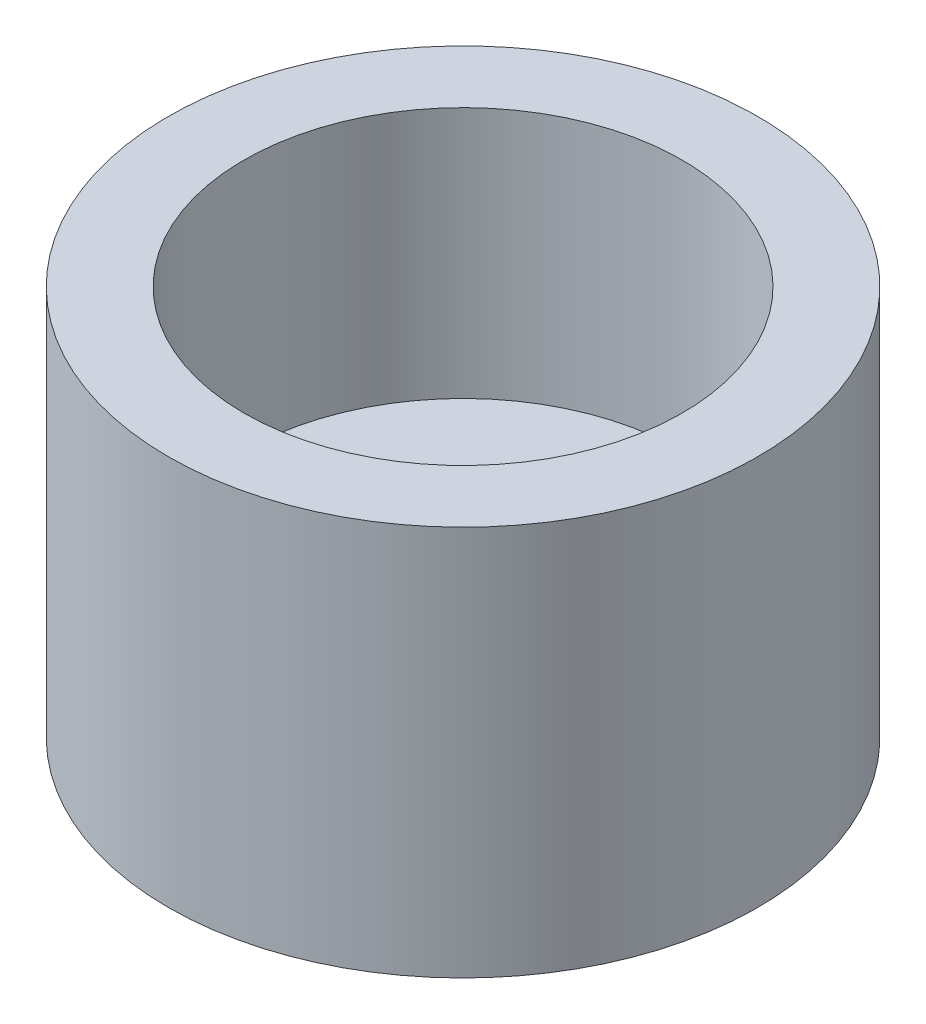
ISO-10303-21;
HEADER;
FILE_DESCRIPTION(('STEP AP214'),'2;1');
FILE_NAME('part.step','',(''),(''),'','','');
FILE_SCHEMA(('AUTOMOTIVE_DESIGN { 1 0 10303 214 1 1 1 1 }'));
ENDSEC;
DATA;
#1=APPLICATION_CONTEXT('core data for automotive mechanical design processes');
#2=APPLICATION_PROTOCOL_DEFINITION('international standard','automotive_design',2000,#1);
#3=PRODUCT_CONTEXT('',#1,'mechanical');
#4=PRODUCT('Part','Part','',(#3));
#5=PRODUCT_RELATED_PRODUCT_CATEGORY('part','',(#4));
#6=PRODUCT_DEFINITION_FORMATION('','',#4);
#7=PRODUCT_DEFINITION_CONTEXT('part definition',#1,'design');
#8=PRODUCT_DEFINITION('design','',#6,#7);
#9=PRODUCT_DEFINITION_SHAPE('','',#8);
#10=(LENGTH_UNIT() NAMED_UNIT(*) SI_UNIT(.MILLI.,.METRE.));
#11=(NAMED_UNIT(*) PLANE_ANGLE_UNIT() SI_UNIT($,.RADIAN.));
#12=(NAMED_UNIT(*) SI_UNIT($,.STERADIAN.) SOLID_ANGLE_UNIT());
#13=UNCERTAINTY_MEASURE_WITH_UNIT(LENGTH_MEASURE(1.E-05),#10,'distance_accuracy_value','');
#14=(GEOMETRIC_REPRESENTATION_CONTEXT(3) GLOBAL_UNCERTAINTY_ASSIGNED_CONTEXT((#13)) GLOBAL_UNIT_ASSIGNED_CONTEXT((#10,
#11,#12)) REPRESENTATION_CONTEXT('',''));
#15=CARTESIAN_POINT('',(0.,0.,0.));
#16=DIRECTION('',(0.,0.,1.));
#17=DIRECTION('',(1.,0.,0.));
#18=AXIS2_PLACEMENT_3D('',#15,#16,#17);
#19=CARTESIAN_POINT('',(909.483870967741,39.7387096774195,0.));
#20=DIRECTION('',(0.,-1.,0.));
#21=DIRECTION('',(0.,0.,-1.));
#22=AXIS2_PLACEMENT_3D('',#19,#20,#21);
#23=PLANE('',#22);
#24=CARTESIAN_POINT('',(0.,39.7387096774194,0.));
#25=DIRECTION('',(0.,1.,0.));
#26=DIRECTION('',(0.,0.,1.));
#27=AXIS2_PLACEMENT_3D('',#24,#25,#26);
#28=CIRCLE('',#27,249.083870967742);
#29=CARTESIAN_POINT('',(0.,39.7387096774194,249.083870967742));
#30=VERTEX_POINT('',#29);
#31=EDGE_CURVE('E10',#30,#30,#28,.T.);
#32=ORIENTED_EDGE('',*,*,#31,.F.);
#33=EDGE_LOOP('',(#32));
#34=FACE_BOUND('',#33,.T.);
#35=CARTESIAN_POINT('',(0.,39.7387096774195,0.));
#36=DIRECTION('',(0.,1.,0.));
#37=DIRECTION('',(0.,0.,1.));
#38=AXIS2_PLACEMENT_3D('',#35,#36,#37);
#39=CIRCLE('',#38,884.083870967742);
#40=CARTESIAN_POINT('',(0.,39.7387096774195,884.083870967742));
#41=VERTEX_POINT('',#40);
#42=EDGE_CURVE('E60',#41,#41,#39,.T.);
#43=ORIENTED_EDGE('',*,*,#42,.T.);
#44=EDGE_LOOP('',(#43));
#45=FACE_BOUND('',#44,.T.);
#46=ADVANCED_FACE('F32',(#34,#45),#23,.F.);
#47=CARTESIAN_POINT('',(0.,989.370967741936,0.));
#48=DIRECTION('',(0.,1.,0.));
#49=DIRECTION('',(0.,0.,1.));
#50=AXIS2_PLACEMENT_3D('',#47,#48,#49);
#51=CYLINDRICAL_SURFACE('',#50,249.083870967742);
#52=CARTESIAN_POINT('',(0.,-265.06129032258,0.));
#53=DIRECTION('',(0.,1.,0.));
#54=DIRECTION('',(0.,0.,1.));
#55=AXIS2_PLACEMENT_3D('',#52,#53,#54);
#56=CIRCLE('',#55,249.083870967742);
#57=CARTESIAN_POINT('',(0.,-265.06129032258,249.083870967742));
#58=VERTEX_POINT('',#57);
#59=EDGE_CURVE('E38',#58,#58,#56,.T.);
#60=ORIENTED_EDGE('',*,*,#59,.F.);
#61=EDGE_LOOP('',(#60));
#62=FACE_BOUND('',#61,.T.);
#63=ORIENTED_EDGE('',*,*,#31,.T.);
#64=EDGE_LOOP('',(#63));
#65=FACE_BOUND('',#64,.T.);
#66=ADVANCED_FACE('F128',(#62,#65),#51,.F.);
#67=CARTESIAN_POINT('',(274.483870967742,-265.061290322581,0.));
#68=DIRECTION('',(0.,1.,0.));
#69=DIRECTION('',(0.,0.,1.));
#70=AXIS2_PLACEMENT_3D('',#67,#68,#69);
#71=PLANE('',#70);
#72=CARTESIAN_POINT('',(0.,-265.06129032258,0.));
#73=DIRECTION('',(0.,1.,0.));
#74=DIRECTION('',(0.,0.,1.));
#75=AXIS2_PLACEMENT_3D('',#72,#73,#74);
#76=CIRCLE('',#75,884.083870967742);
#77=CARTESIAN_POINT('',(0.,-265.06129032258,884.083870967742));
#78=VERTEX_POINT('',#77);
#79=EDGE_CURVE('E42',#78,#78,#76,.T.);
#80=ORIENTED_EDGE('',*,*,#79,.F.);
#81=EDGE_LOOP('',(#80));
#82=FACE_BOUND('',#81,.T.);
#83=ORIENTED_EDGE('',*,*,#59,.T.);
#84=EDGE_LOOP('',(#83));
#85=FACE_BOUND('',#84,.T.);
#86=ADVANCED_FACE('F125',(#82,#85),#71,.F.);
#87=CARTESIAN_POINT('',(0.,989.370967741936,0.));
#88=DIRECTION('',(0.,1.,0.));
#89=DIRECTION('',(0.,0.,1.));
#90=AXIS2_PLACEMENT_3D('',#87,#88,#89);
#91=CYLINDRICAL_SURFACE('',#90,884.083870967742);
#92=CARTESIAN_POINT('',(0.,-519.061290322581,0.));
#93=DIRECTION('',(0.,1.,0.));
#94=DIRECTION('',(0.,0.,1.));
#95=AXIS2_PLACEMENT_3D('',#92,#93,#94);
#96=CIRCLE('',#95,884.083870967742);
#97=CARTESIAN_POINT('',(0.,-519.061290322581,884.083870967742));
#98=VERTEX_POINT('',#97);
#99=EDGE_CURVE('E46',#98,#98,#96,.T.);
#100=ORIENTED_EDGE('',*,*,#99,.F.);
#101=EDGE_LOOP('',(#100));
#102=FACE_BOUND('',#101,.T.);
#103=ORIENTED_EDGE('',*,*,#79,.T.);
#104=EDGE_LOOP('',(#103));
#105=FACE_BOUND('',#104,.T.);
#106=ADVANCED_FACE('F121',(#102,#105),#91,.F.);
#107=CARTESIAN_POINT('',(909.483870967741,-519.061290322581,0.));
#108=DIRECTION('',(0.,1.,0.));
#109=DIRECTION('',(0.,0.,1.));
#110=AXIS2_PLACEMENT_3D('',#107,#108,#109);
#111=PLANE('',#110);
#112=CARTESIAN_POINT('',(0.,-519.061290322581,0.));
#113=DIRECTION('',(0.,1.,0.));
#114=DIRECTION('',(0.,0.,1.));
#115=AXIS2_PLACEMENT_3D('',#112,#113,#114);
#116=CIRCLE('',#115,1188.88387096774);
#117=CARTESIAN_POINT('',(0.,-519.061290322581,1188.88387096774));
#118=VERTEX_POINT('',#117);
#119=EDGE_CURVE('E51',#118,#118,#116,.T.);
#120=ORIENTED_EDGE('',*,*,#119,.F.);
#121=EDGE_LOOP('',(#120));
#122=FACE_BOUND('',#121,.T.);
#123=ORIENTED_EDGE('',*,*,#99,.T.);
#124=EDGE_LOOP('',(#123));
#125=FACE_BOUND('',#124,.T.);
#126=ADVANCED_FACE('F117',(#122,#125),#111,.F.);
#127=CARTESIAN_POINT('',(0.,989.370967741936,0.));
#128=DIRECTION('',(0.,1.,0.));
#129=DIRECTION('',(0.,0.,1.));
#130=AXIS2_PLACEMENT_3D('',#127,#128,#129);
#131=CYLINDRICAL_SURFACE('',#130,1188.88387096774);
#132=CARTESIAN_POINT('',(0.,1055.73870967742,0.));
#133=DIRECTION('',(0.,1.,0.));
#134=DIRECTION('',(0.,0.,1.));
#135=AXIS2_PLACEMENT_3D('',#132,#133,#134);
#136=CIRCLE('',#135,1188.88387096774);
#137=CARTESIAN_POINT('',(0.,1055.73870967742,1188.88387096774));
#138=VERTEX_POINT('',#137);
#139=EDGE_CURVE('E54',#138,#138,#136,.T.);
#140=ORIENTED_EDGE('',*,*,#139,.F.);
#141=EDGE_LOOP('',(#140));
#142=FACE_BOUND('',#141,.T.);
#143=ORIENTED_EDGE('',*,*,#119,.T.);
#144=EDGE_LOOP('',(#143));
#145=FACE_BOUND('',#144,.T.);
#146=ADVANCED_FACE('F113',(#142,#145),#131,.T.);
#147=CARTESIAN_POINT('',(1163.48387096774,1055.73870967742,0.));
#148=DIRECTION('',(0.,-1.,0.));
#149=DIRECTION('',(0.,0.,-1.));
#150=AXIS2_PLACEMENT_3D('',#147,#148,#149);
#151=PLANE('',#150);
#152=CARTESIAN_POINT('',(0.,1055.73870967742,0.));
#153=DIRECTION('',(0.,1.,0.));
#154=DIRECTION('',(0.,0.,1.));
#155=AXIS2_PLACEMENT_3D('',#152,#153,#154);
#156=CIRCLE('',#155,884.083870967741);
#157=CARTESIAN_POINT('',(0.,1055.73870967742,884.083870967741));
#158=VERTEX_POINT('',#157);
#159=EDGE_CURVE('E57',#158,#158,#156,.T.);
#160=ORIENTED_EDGE('',*,*,#159,.F.);
#161=EDGE_LOOP('',(#160));
#162=FACE_BOUND('',#161,.T.);
#163=ORIENTED_EDGE('',*,*,#139,.T.);
#164=EDGE_LOOP('',(#163));
#165=FACE_BOUND('',#164,.T.);
#166=ADVANCED_FACE('F109',(#162,#165),#151,.F.);
#167=CARTESIAN_POINT('',(0.,989.370967741936,0.));
#168=DIRECTION('',(0.,1.,0.));
#169=DIRECTION('',(0.,0.,1.));
#170=AXIS2_PLACEMENT_3D('',#167,#168,#169);
#171=CYLINDRICAL_SURFACE('',#170,884.083870967741);
#172=ORIENTED_EDGE('',*,*,#42,.F.);
#173=EDGE_LOOP('',(#172));
#174=FACE_BOUND('',#173,.T.);
#175=ORIENTED_EDGE('',*,*,#159,.T.);
#176=EDGE_LOOP('',(#175));
#177=FACE_BOUND('',#176,.T.);
#178=ADVANCED_FACE('F107',(#174,#177),#171,.F.);
#179=CLOSED_SHELL('',(#46,#66,#86,#106,#126,#146,#166,#178));
#180=CARTESIAN_POINT('',(909.483870967741,14.3387096774195,0.));
#181=DIRECTION('',(0.,-1.,0.));
#182=DIRECTION('',(0.,0.,-1.));
#183=AXIS2_PLACEMENT_3D('',#180,#181,#182);
#184=PLANE('',#183);
#185=CARTESIAN_POINT('',(0.,14.3387096774195,0.));
#186=DIRECTION('',(0.,1.,0.));
#187=DIRECTION('',(0.,0.,1.));
#188=AXIS2_PLACEMENT_3D('',#185,#186,#187);
#189=CIRCLE('',#188,274.483870967742);
#190=CARTESIAN_POINT('',(0.,14.3387096774195,274.483870967742));
#191=VERTEX_POINT('',#190);
#192=EDGE_CURVE('E63',#191,#191,#189,.T.);
#193=ORIENTED_EDGE('',*,*,#192,.T.);
#194=EDGE_LOOP('',(#193));
#195=FACE_BOUND('',#194,.T.);
#196=CARTESIAN_POINT('',(0.,14.3387096774195,0.));
#197=DIRECTION('',(0.,1.,0.));
#198=DIRECTION('',(0.,0.,1.));
#199=AXIS2_PLACEMENT_3D('',#196,#197,#198);
#200=CIRCLE('',#199,909.483870967741);
#201=CARTESIAN_POINT('',(0.,14.3387096774195,909.483870967741));
#202=VERTEX_POINT('',#201);
#203=EDGE_CURVE('E84',#202,#202,#200,.T.);
#204=ORIENTED_EDGE('',*,*,#203,.F.);
#205=EDGE_LOOP('',(#204));
#206=FACE_BOUND('',#205,.T.);
#207=ADVANCED_FACE('F91',(#195,#206),#184,.T.);
#208=CARTESIAN_POINT('',(0.,989.370967741936,0.));
#209=DIRECTION('',(0.,1.,0.));
#210=DIRECTION('',(0.,0.,1.));
#211=AXIS2_PLACEMENT_3D('',#208,#209,#210);
#212=CYLINDRICAL_SURFACE('',#211,274.483870967742);
#213=CARTESIAN_POINT('',(0.,-239.661290322581,0.));
#214=DIRECTION('',(0.,1.,0.));
#215=DIRECTION('',(0.,0.,1.));
#216=AXIS2_PLACEMENT_3D('',#213,#214,#215);
#217=CIRCLE('',#216,274.483870967742);
#218=CARTESIAN_POINT('',(0.,-239.661290322581,274.483870967742));
#219=VERTEX_POINT('',#218);
#220=EDGE_CURVE('E66',#219,#219,#217,.T.);
#221=ORIENTED_EDGE('',*,*,#220,.T.);
#222=EDGE_LOOP('',(#221));
#223=FACE_BOUND('',#222,.T.);
#224=ORIENTED_EDGE('',*,*,#192,.F.);
#225=EDGE_LOOP('',(#224));
#226=FACE_BOUND('',#225,.T.);
#227=ADVANCED_FACE('F93',(#223,#226),#212,.T.);
#228=CARTESIAN_POINT('',(274.483870967742,-239.661290322581,0.));
#229=DIRECTION('',(0.,1.,0.));
#230=DIRECTION('',(0.,0.,1.));
#231=AXIS2_PLACEMENT_3D('',#228,#229,#230);
#232=PLANE('',#231);
#233=CARTESIAN_POINT('',(0.,-239.661290322581,0.));
#234=DIRECTION('',(0.,1.,0.));
#235=DIRECTION('',(0.,0.,1.));
#236=AXIS2_PLACEMENT_3D('',#233,#234,#235);
#237=CIRCLE('',#236,909.483870967741);
#238=CARTESIAN_POINT('',(0.,-239.661290322581,909.483870967741));
#239=VERTEX_POINT('',#238);
#240=EDGE_CURVE('E69',#239,#239,#237,.T.);
#241=ORIENTED_EDGE('',*,*,#240,.T.);
#242=EDGE_LOOP('',(#241));
#243=FACE_BOUND('',#242,.T.);
#244=ORIENTED_EDGE('',*,*,#220,.F.);
#245=EDGE_LOOP('',(#244));
#246=FACE_BOUND('',#245,.T.);
#247=ADVANCED_FACE('F101',(#243,#246),#232,.T.);
#248=CARTESIAN_POINT('',(0.,989.370967741936,0.));
#249=DIRECTION('',(0.,1.,0.));
#250=DIRECTION('',(0.,0.,1.));
#251=AXIS2_PLACEMENT_3D('',#248,#249,#250);
#252=CYLINDRICAL_SURFACE('',#251,909.483870967741);
#253=CARTESIAN_POINT('',(0.,-493.661290322581,0.));
#254=DIRECTION('',(0.,1.,0.));
#255=DIRECTION('',(0.,0.,1.));
#256=AXIS2_PLACEMENT_3D('',#253,#254,#255);
#257=CIRCLE('',#256,909.483870967741);
#258=CARTESIAN_POINT('',(0.,-493.661290322581,909.483870967741));
#259=VERTEX_POINT('',#258);
#260=EDGE_CURVE('E72',#259,#259,#257,.T.);
#261=ORIENTED_EDGE('',*,*,#260,.T.);
#262=EDGE_LOOP('',(#261));
#263=FACE_BOUND('',#262,.T.);
#264=ORIENTED_EDGE('',*,*,#240,.F.);
#265=EDGE_LOOP('',(#264));
#266=FACE_BOUND('',#265,.T.);
#267=ADVANCED_FACE('F209',(#263,#266),#252,.T.);
#268=CARTESIAN_POINT('',(909.483870967741,-493.661290322581,0.));
#269=DIRECTION('',(0.,1.,0.));
#270=DIRECTION('',(0.,0.,1.));
#271=AXIS2_PLACEMENT_3D('',#268,#269,#270);
#272=PLANE('',#271);
#273=CARTESIAN_POINT('',(0.,-493.661290322581,0.));
#274=DIRECTION('',(0.,1.,0.));
#275=DIRECTION('',(0.,0.,1.));
#276=AXIS2_PLACEMENT_3D('',#273,#274,#275);
#277=CIRCLE('',#276,1163.48387096774);
#278=CARTESIAN_POINT('',(0.,-493.661290322581,1163.48387096774));
#279=VERTEX_POINT('',#278);
#280=EDGE_CURVE('E75',#279,#279,#277,.T.);
#281=ORIENTED_EDGE('',*,*,#280,.T.);
#282=EDGE_LOOP('',(#281));
#283=FACE_BOUND('',#282,.T.);
#284=ORIENTED_EDGE('',*,*,#260,.F.);
#285=EDGE_LOOP('',(#284));
#286=FACE_BOUND('',#285,.T.);
#287=ADVANCED_FACE('F218',(#283,#286),#272,.T.);
#288=CARTESIAN_POINT('',(0.,989.370967741936,0.));
#289=DIRECTION('',(0.,1.,0.));
#290=DIRECTION('',(0.,0.,1.));
#291=AXIS2_PLACEMENT_3D('',#288,#289,#290);
#292=CYLINDRICAL_SURFACE('',#291,1163.48387096774);
#293=CARTESIAN_POINT('',(0.,1030.33870967742,0.));
#294=DIRECTION('',(0.,1.,0.));
#295=DIRECTION('',(0.,0.,1.));
#296=AXIS2_PLACEMENT_3D('',#293,#294,#295);
#297=CIRCLE('',#296,1163.48387096774);
#298=CARTESIAN_POINT('',(0.,1030.33870967742,1163.48387096774));
#299=VERTEX_POINT('',#298);
#300=EDGE_CURVE('E78',#299,#299,#297,.T.);
#301=ORIENTED_EDGE('',*,*,#300,.T.);
#302=EDGE_LOOP('',(#301));
#303=FACE_BOUND('',#302,.T.);
#304=ORIENTED_EDGE('',*,*,#280,.F.);
#305=EDGE_LOOP('',(#304));
#306=FACE_BOUND('',#305,.T.);
#307=ADVANCED_FACE('F228',(#303,#306),#292,.F.);
#308=CARTESIAN_POINT('',(1163.48387096774,1030.33870967742,0.));
#309=DIRECTION('',(0.,-1.,0.));
#310=DIRECTION('',(0.,0.,-1.));
#311=AXIS2_PLACEMENT_3D('',#308,#309,#310);
#312=PLANE('',#311);
#313=CARTESIAN_POINT('',(0.,1030.33870967742,0.));
#314=DIRECTION('',(0.,1.,0.));
#315=DIRECTION('',(0.,0.,1.));
#316=AXIS2_PLACEMENT_3D('',#313,#314,#315);
#317=CIRCLE('',#316,909.483870967741);
#318=CARTESIAN_POINT('',(0.,1030.33870967742,909.483870967741));
#319=VERTEX_POINT('',#318);
#320=EDGE_CURVE('E81',#319,#319,#317,.T.);
#321=ORIENTED_EDGE('',*,*,#320,.T.);
#322=EDGE_LOOP('',(#321));
#323=FACE_BOUND('',#322,.T.);
#324=ORIENTED_EDGE('',*,*,#300,.F.);
#325=EDGE_LOOP('',(#324));
#326=FACE_BOUND('',#325,.T.);
#327=ADVANCED_FACE('F238',(#323,#326),#312,.T.);
#328=CARTESIAN_POINT('',(0.,989.370967741936,0.));
#329=DIRECTION('',(0.,1.,0.));
#330=DIRECTION('',(0.,0.,1.));
#331=AXIS2_PLACEMENT_3D('',#328,#329,#330);
#332=CYLINDRICAL_SURFACE('',#331,909.483870967741);
#333=ORIENTED_EDGE('',*,*,#203,.T.);
#334=EDGE_LOOP('',(#333));
#335=FACE_BOUND('',#334,.T.);
#336=ORIENTED_EDGE('',*,*,#320,.F.);
#337=EDGE_LOOP('',(#336));
#338=FACE_BOUND('',#337,.T.);
#339=ADVANCED_FACE('F88',(#335,#338),#332,.T.);
#340=CLOSED_SHELL('',(#207,#227,#247,#267,#287,#307,#327,#339));
#341=ORIENTED_CLOSED_SHELL('',*,#340,.T.);
#342=BREP_WITH_VOIDS('B2',#179,(#341));
#343=ADVANCED_BREP_SHAPE_REPRESENTATION('',(#18,#342),#14);
#344=SHAPE_DEFINITION_REPRESENTATION(#9,#343);
ENDSEC;
END-ISO-10303-21;
